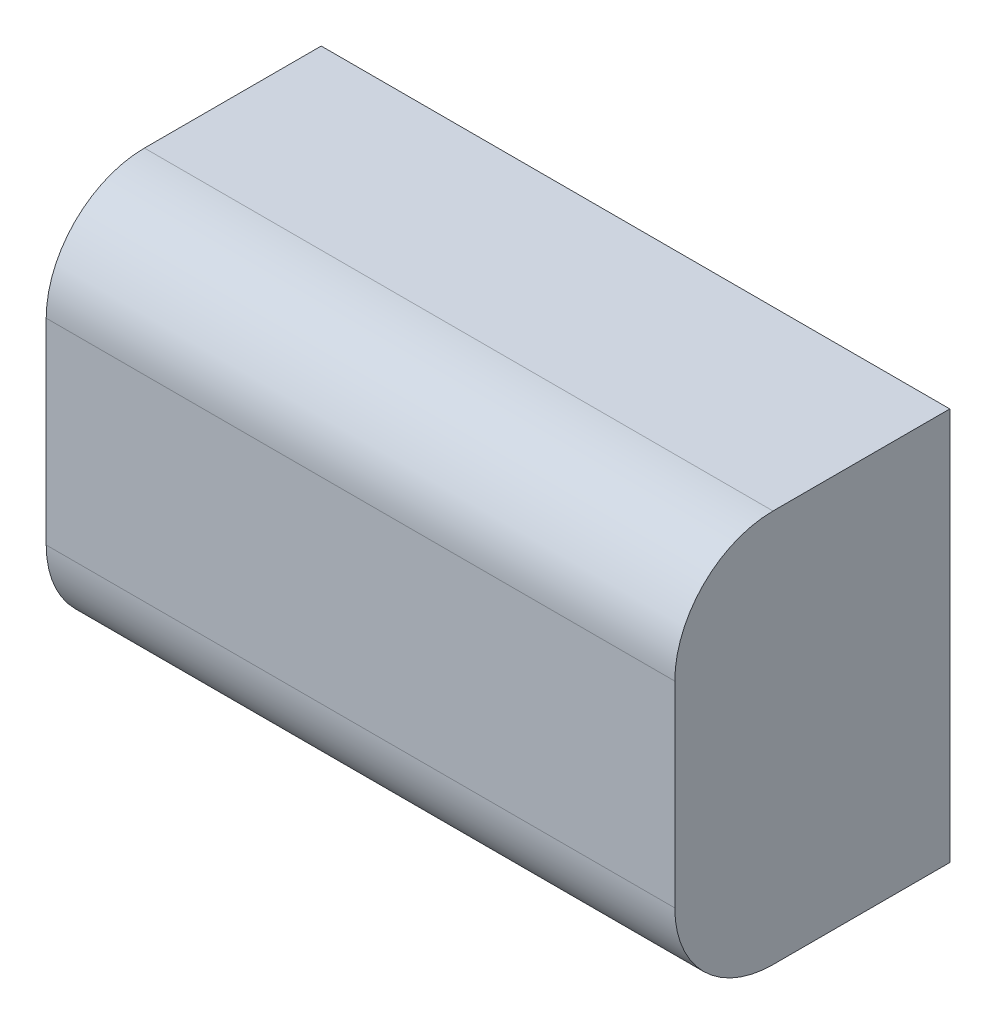
ISO-10303-21;
HEADER;
FILE_DESCRIPTION(('STEP AP214'),'2;1');
FILE_NAME('part.step','',(''),(''),'','','');
FILE_SCHEMA(('AUTOMOTIVE_DESIGN { 1 0 10303 214 1 1 1 1 }'));
ENDSEC;
DATA;
#1=APPLICATION_CONTEXT('core data for automotive mechanical design processes');
#2=APPLICATION_PROTOCOL_DEFINITION('international standard','automotive_design',2000,#1);
#3=PRODUCT_CONTEXT('',#1,'mechanical');
#4=PRODUCT('Part','Part','',(#3));
#5=PRODUCT_RELATED_PRODUCT_CATEGORY('part','',(#4));
#6=PRODUCT_DEFINITION_FORMATION('','',#4);
#7=PRODUCT_DEFINITION_CONTEXT('part definition',#1,'design');
#8=PRODUCT_DEFINITION('design','',#6,#7);
#9=PRODUCT_DEFINITION_SHAPE('','',#8);
#10=(LENGTH_UNIT() NAMED_UNIT(*) SI_UNIT(.MILLI.,.METRE.));
#11=(NAMED_UNIT(*) PLANE_ANGLE_UNIT() SI_UNIT($,.RADIAN.));
#12=(NAMED_UNIT(*) SI_UNIT($,.STERADIAN.) SOLID_ANGLE_UNIT());
#13=UNCERTAINTY_MEASURE_WITH_UNIT(LENGTH_MEASURE(1.E-05),#10,'distance_accuracy_value','');
#14=(GEOMETRIC_REPRESENTATION_CONTEXT(3) GLOBAL_UNCERTAINTY_ASSIGNED_CONTEXT((#13)) GLOBAL_UNIT_ASSIGNED_CONTEXT((#10,
#11,#12)) REPRESENTATION_CONTEXT('',''));
#15=CARTESIAN_POINT('',(0.,0.,0.));
#16=DIRECTION('',(0.,0.,1.));
#17=DIRECTION('',(1.,0.,0.));
#18=AXIS2_PLACEMENT_3D('',#15,#16,#17);
#19=CARTESIAN_POINT('',(101.6,63.5,44.45));
#20=DIRECTION('',(-1.,0.,0.));
#21=DIRECTION('',(0.,0.,1.));
#22=AXIS2_PLACEMENT_3D('',#19,#20,#21);
#23=PLANE('',#22);
#24=DIRECTION('',(0.,1.,0.));
#25=VECTOR('',#24,1.);
#26=CARTESIAN_POINT('',(101.6,63.5,44.45));
#27=LINE('',#26,#25);
#28=CARTESIAN_POINT('',(101.6,-31.75,44.45));
#29=VERTEX_POINT('',#28);
#30=CARTESIAN_POINT('',(101.6,31.75,44.45));
#31=VERTEX_POINT('',#30);
#32=EDGE_CURVE('E121',#29,#31,#27,.T.);
#33=ORIENTED_EDGE('',*,*,#32,.F.);
#34=CARTESIAN_POINT('',(101.6,-31.75,12.7));
#35=DIRECTION('',(-1.,0.,0.));
#36=DIRECTION('',(0.,0.,1.));
#37=AXIS2_PLACEMENT_3D('',#34,#35,#36);
#38=CIRCLE('',#37,31.75);
#39=CARTESIAN_POINT('',(101.6,-63.5,12.7));
#40=VERTEX_POINT('',#39);
#41=EDGE_CURVE('E133',#29,#40,#38,.F.);
#42=ORIENTED_EDGE('',*,*,#41,.T.);
#43=DIRECTION('',(0.,0.,-1.));
#44=VECTOR('',#43,1.);
#45=CARTESIAN_POINT('',(101.6,-63.5,44.45));
#46=LINE('',#45,#44);
#47=CARTESIAN_POINT('',(101.6,-63.5,-44.45));
#48=VERTEX_POINT('',#47);
#49=EDGE_CURVE('E107',#40,#48,#46,.T.);
#50=ORIENTED_EDGE('',*,*,#49,.T.);
#51=DIRECTION('',(0.,1.,0.));
#52=VECTOR('',#51,1.);
#53=CARTESIAN_POINT('',(101.6,63.5,-44.45));
#54=LINE('',#53,#52);
#55=CARTESIAN_POINT('',(101.6,63.5,-44.45));
#56=VERTEX_POINT('',#55);
#57=EDGE_CURVE('E102',#48,#56,#54,.T.);
#58=ORIENTED_EDGE('',*,*,#57,.T.);
#59=DIRECTION('',(0.,0.,-1.));
#60=VECTOR('',#59,1.);
#61=CARTESIAN_POINT('',(101.6,63.5,44.45));
#62=LINE('',#61,#60);
#63=CARTESIAN_POINT('',(101.6,63.5,12.7));
#64=VERTEX_POINT('',#63);
#65=EDGE_CURVE('E86',#64,#56,#62,.T.);
#66=ORIENTED_EDGE('',*,*,#65,.F.);
#67=CARTESIAN_POINT('',(101.6,31.75,12.7));
#68=DIRECTION('',(-1.,0.,0.));
#69=DIRECTION('',(0.,0.,1.));
#70=AXIS2_PLACEMENT_3D('',#67,#68,#69);
#71=CIRCLE('',#70,31.75);
#72=EDGE_CURVE('E131',#64,#31,#71,.F.);
#73=ORIENTED_EDGE('',*,*,#72,.T.);
#74=EDGE_LOOP('',(#33,#42,#50,#58,#66,#73));
#75=FACE_BOUND('',#74,.T.);
#76=ADVANCED_FACE('F33',(#75),#23,.F.);
#77=CARTESIAN_POINT('',(-101.6,63.5,44.45));
#78=DIRECTION('',(0.,-1.,0.));
#79=DIRECTION('',(0.,0.,-1.));
#80=AXIS2_PLACEMENT_3D('',#77,#78,#79);
#81=PLANE('',#80);
#82=DIRECTION('',(0.,0.,-1.));
#83=VECTOR('',#82,1.);
#84=CARTESIAN_POINT('',(-101.6,63.5,44.45));
#85=LINE('',#84,#83);
#86=CARTESIAN_POINT('',(-101.6,63.5,12.7));
#87=VERTEX_POINT('',#86);
#88=CARTESIAN_POINT('',(-101.6,63.5,-44.45));
#89=VERTEX_POINT('',#88);
#90=EDGE_CURVE('E96',#87,#89,#85,.T.);
#91=ORIENTED_EDGE('',*,*,#90,.F.);
#92=DIRECTION('',(-1.,0.,0.));
#93=VECTOR('',#92,1.);
#94=CARTESIAN_POINT('',(101.6,63.5,12.7));
#95=LINE('',#94,#93);
#96=EDGE_CURVE('E11',#87,#64,#95,.F.);
#97=ORIENTED_EDGE('',*,*,#96,.T.);
#98=ORIENTED_EDGE('',*,*,#65,.T.);
#99=DIRECTION('',(-1.,0.,0.));
#100=VECTOR('',#99,1.);
#101=CARTESIAN_POINT('',(-101.6,63.5,-44.45));
#102=LINE('',#101,#100);
#103=EDGE_CURVE('E89',#56,#89,#102,.T.);
#104=ORIENTED_EDGE('',*,*,#103,.T.);
#105=EDGE_LOOP('',(#91,#97,#98,#104));
#106=FACE_BOUND('',#105,.T.);
#107=ADVANCED_FACE('F88',(#106),#81,.F.);
#108=CARTESIAN_POINT('',(-101.6,63.5,44.45));
#109=DIRECTION('',(1.,0.,0.));
#110=DIRECTION('',(0.,1.,0.));
#111=AXIS2_PLACEMENT_3D('',#108,#109,#110);
#112=PLANE('',#111);
#113=DIRECTION('',(0.,0.,-1.));
#114=VECTOR('',#113,1.);
#115=CARTESIAN_POINT('',(-101.6,-63.5,44.45));
#116=LINE('',#115,#114);
#117=CARTESIAN_POINT('',(-101.6,-63.5,12.7));
#118=VERTEX_POINT('',#117);
#119=CARTESIAN_POINT('',(-101.6,-63.5,-44.45));
#120=VERTEX_POINT('',#119);
#121=EDGE_CURVE('E123',#118,#120,#116,.T.);
#122=ORIENTED_EDGE('',*,*,#121,.F.);
#123=CARTESIAN_POINT('',(-101.6,-31.75,12.7));
#124=DIRECTION('',(1.,0.,0.));
#125=DIRECTION('',(0.,1.,0.));
#126=AXIS2_PLACEMENT_3D('',#123,#124,#125);
#127=CIRCLE('',#126,31.75);
#128=CARTESIAN_POINT('',(-101.6,-31.75,44.45));
#129=VERTEX_POINT('',#128);
#130=EDGE_CURVE('E41',#118,#129,#127,.F.);
#131=ORIENTED_EDGE('',*,*,#130,.T.);
#132=DIRECTION('',(0.,-1.,0.));
#133=VECTOR('',#132,1.);
#134=CARTESIAN_POINT('',(-101.6,63.5,44.45));
#135=LINE('',#134,#133);
#136=CARTESIAN_POINT('',(-101.6,31.75,44.45));
#137=VERTEX_POINT('',#136);
#138=EDGE_CURVE('E115',#137,#129,#135,.T.);
#139=ORIENTED_EDGE('',*,*,#138,.F.);
#140=CARTESIAN_POINT('',(-101.6,31.75,12.7));
#141=DIRECTION('',(1.,0.,0.));
#142=DIRECTION('',(0.,1.,0.));
#143=AXIS2_PLACEMENT_3D('',#140,#141,#142);
#144=CIRCLE('',#143,31.75);
#145=EDGE_CURVE('E48',#137,#87,#144,.F.);
#146=ORIENTED_EDGE('',*,*,#145,.T.);
#147=ORIENTED_EDGE('',*,*,#90,.T.);
#148=DIRECTION('',(0.,-1.,0.));
#149=VECTOR('',#148,1.);
#150=CARTESIAN_POINT('',(-101.6,63.5,-44.45));
#151=LINE('',#150,#149);
#152=EDGE_CURVE('E104',#89,#120,#151,.T.);
#153=ORIENTED_EDGE('',*,*,#152,.T.);
#154=EDGE_LOOP('',(#122,#131,#139,#146,#147,#153));
#155=FACE_BOUND('',#154,.T.);
#156=ADVANCED_FACE('F138',(#155),#112,.F.);
#157=CARTESIAN_POINT('',(-101.6,-63.5,44.45));
#158=DIRECTION('',(0.,1.,0.));
#159=DIRECTION('',(0.,0.,1.));
#160=AXIS2_PLACEMENT_3D('',#157,#158,#159);
#161=PLANE('',#160);
#162=ORIENTED_EDGE('',*,*,#49,.F.);
#163=DIRECTION('',(1.,0.,0.));
#164=VECTOR('',#163,1.);
#165=CARTESIAN_POINT('',(-101.6,-63.5,12.7));
#166=LINE('',#165,#164);
#167=EDGE_CURVE('E56',#40,#118,#166,.F.);
#168=ORIENTED_EDGE('',*,*,#167,.T.);
#169=ORIENTED_EDGE('',*,*,#121,.T.);
#170=DIRECTION('',(1.,0.,0.));
#171=VECTOR('',#170,1.);
#172=CARTESIAN_POINT('',(-101.6,-63.5,-44.45));
#173=LINE('',#172,#171);
#174=EDGE_CURVE('E119',#120,#48,#173,.T.);
#175=ORIENTED_EDGE('',*,*,#174,.T.);
#176=EDGE_LOOP('',(#162,#168,#169,#175));
#177=FACE_BOUND('',#176,.T.);
#178=ADVANCED_FACE('F146',(#177),#161,.F.);
#179=CARTESIAN_POINT('',(0.,0.,44.45));
#180=DIRECTION('',(0.,0.,1.));
#181=DIRECTION('',(1.,0.,0.));
#182=AXIS2_PLACEMENT_3D('',#179,#180,#181);
#183=PLANE('',#182);
#184=ORIENTED_EDGE('',*,*,#138,.T.);
#185=DIRECTION('',(1.,0.,0.));
#186=VECTOR('',#185,1.);
#187=CARTESIAN_POINT('',(101.6,-31.75,44.45));
#188=LINE('',#187,#186);
#189=EDGE_CURVE('E128',#129,#29,#188,.T.);
#190=ORIENTED_EDGE('',*,*,#189,.T.);
#191=ORIENTED_EDGE('',*,*,#32,.T.);
#192=DIRECTION('',(-1.,0.,0.));
#193=VECTOR('',#192,1.);
#194=CARTESIAN_POINT('',(-101.6,31.75,44.45));
#195=LINE('',#194,#193);
#196=EDGE_CURVE('E95',#31,#137,#195,.T.);
#197=ORIENTED_EDGE('',*,*,#196,.T.);
#198=EDGE_LOOP('',(#184,#190,#191,#197));
#199=FACE_BOUND('',#198,.T.);
#200=ADVANCED_FACE('F142',(#199),#183,.T.);
#201=CARTESIAN_POINT('',(0.,0.,-44.45));
#202=DIRECTION('',(0.,0.,1.));
#203=DIRECTION('',(1.,0.,0.));
#204=AXIS2_PLACEMENT_3D('',#201,#202,#203);
#205=PLANE('',#204);
#206=CARTESIAN_POINT('',(-12.7,0.,-44.45));
#207=DIRECTION('',(0.,0.,-1.));
#208=DIRECTION('',(-1.,0.,0.));
#209=AXIS2_PLACEMENT_3D('',#206,#207,#208);
#210=CIRCLE('',#209,4.7625);
#211=CARTESIAN_POINT('',(-17.4625,0.,-44.45));
#212=VERTEX_POINT('',#211);
#213=EDGE_CURVE('E152',#212,#212,#210,.T.);
#214=ORIENTED_EDGE('',*,*,#213,.F.);
#215=EDGE_LOOP('',(#214));
#216=FACE_BOUND('',#215,.T.);
#217=CARTESIAN_POINT('',(12.7,0.,-44.45));
#218=DIRECTION('',(0.,0.,-1.));
#219=DIRECTION('',(-1.,0.,0.));
#220=AXIS2_PLACEMENT_3D('',#217,#218,#219);
#221=CIRCLE('',#220,4.7625);
#222=CARTESIAN_POINT('',(7.9375,0.,-44.45));
#223=VERTEX_POINT('',#222);
#224=EDGE_CURVE('E112',#223,#223,#221,.T.);
#225=ORIENTED_EDGE('',*,*,#224,.F.);
#226=EDGE_LOOP('',(#225));
#227=FACE_BOUND('',#226,.T.);
#228=ORIENTED_EDGE('',*,*,#57,.F.);
#229=ORIENTED_EDGE('',*,*,#174,.F.);
#230=ORIENTED_EDGE('',*,*,#152,.F.);
#231=ORIENTED_EDGE('',*,*,#103,.F.);
#232=EDGE_LOOP('',(#228,#229,#230,#231));
#233=FACE_BOUND('',#232,.T.);
#234=ADVANCED_FACE('F100',(#216,#227,#233),#205,.F.);
#235=CARTESIAN_POINT('',(0.,-31.75,12.7));
#236=DIRECTION('',(-1.,0.,0.));
#237=DIRECTION('',(0.,0.,1.));
#238=AXIS2_PLACEMENT_3D('',#235,#236,#237);
#239=CYLINDRICAL_SURFACE('',#238,31.75);
#240=ORIENTED_EDGE('',*,*,#130,.F.);
#241=ORIENTED_EDGE('',*,*,#167,.F.);
#242=ORIENTED_EDGE('',*,*,#41,.F.);
#243=ORIENTED_EDGE('',*,*,#189,.F.);
#244=EDGE_LOOP('',(#240,#241,#242,#243));
#245=FACE_BOUND('',#244,.T.);
#246=ADVANCED_FACE('F145',(#245),#239,.T.);
#247=CARTESIAN_POINT('',(0.,31.75,12.7));
#248=DIRECTION('',(1.,0.,0.));
#249=DIRECTION('',(0.,0.,-1.));
#250=AXIS2_PLACEMENT_3D('',#247,#248,#249);
#251=CYLINDRICAL_SURFACE('',#250,31.75);
#252=ORIENTED_EDGE('',*,*,#72,.F.);
#253=ORIENTED_EDGE('',*,*,#96,.F.);
#254=ORIENTED_EDGE('',*,*,#145,.F.);
#255=ORIENTED_EDGE('',*,*,#196,.F.);
#256=EDGE_LOOP('',(#252,#253,#254,#255));
#257=FACE_BOUND('',#256,.T.);
#258=ADVANCED_FACE('F35',(#257),#251,.T.);
#259=CARTESIAN_POINT('',(12.7,0.,-19.05));
#260=DIRECTION('',(0.,0.,-1.));
#261=DIRECTION('',(-1.,0.,0.));
#262=AXIS2_PLACEMENT_3D('',#259,#260,#261);
#263=CYLINDRICAL_SURFACE('',#262,4.7625);
#264=CARTESIAN_POINT('',(12.7,0.,-19.05));
#265=DIRECTION('',(0.,0.,-1.));
#266=DIRECTION('',(-1.,0.,0.));
#267=AXIS2_PLACEMENT_3D('',#264,#265,#266);
#268=CIRCLE('',#267,4.7625);
#269=CARTESIAN_POINT('',(7.9375,0.,-19.05));
#270=VERTEX_POINT('',#269);
#271=EDGE_CURVE('E109',#270,#270,#268,.T.);
#272=ORIENTED_EDGE('',*,*,#271,.F.);
#273=EDGE_LOOP('',(#272));
#274=FACE_BOUND('',#273,.T.);
#275=ORIENTED_EDGE('',*,*,#224,.T.);
#276=EDGE_LOOP('',(#275));
#277=FACE_BOUND('',#276,.T.);
#278=ADVANCED_FACE('F172',(#274,#277),#263,.F.);
#279=CARTESIAN_POINT('',(12.7,0.,-19.05));
#280=DIRECTION('',(0.,0.,-1.));
#281=DIRECTION('',(-1.,0.,0.));
#282=AXIS2_PLACEMENT_3D('',#279,#280,#281);
#283=PLANE('',#282);
#284=ORIENTED_EDGE('',*,*,#271,.T.);
#285=EDGE_LOOP('',(#284));
#286=FACE_BOUND('',#285,.T.);
#287=ADVANCED_FACE('F163',(#286),#283,.T.);
#288=CARTESIAN_POINT('',(-12.7,0.,-19.05));
#289=DIRECTION('',(0.,0.,-1.));
#290=DIRECTION('',(-1.,0.,0.));
#291=AXIS2_PLACEMENT_3D('',#288,#289,#290);
#292=CYLINDRICAL_SURFACE('',#291,4.7625);
#293=CARTESIAN_POINT('',(-12.7,0.,-19.05));
#294=DIRECTION('',(0.,0.,-1.));
#295=DIRECTION('',(-1.,0.,0.));
#296=AXIS2_PLACEMENT_3D('',#293,#294,#295);
#297=CIRCLE('',#296,4.7625);
#298=CARTESIAN_POINT('',(-17.4625,0.,-19.05));
#299=VERTEX_POINT('',#298);
#300=EDGE_CURVE('E150',#299,#299,#297,.T.);
#301=ORIENTED_EDGE('',*,*,#300,.F.);
#302=EDGE_LOOP('',(#301));
#303=FACE_BOUND('',#302,.T.);
#304=ORIENTED_EDGE('',*,*,#213,.T.);
#305=EDGE_LOOP('',(#304));
#306=FACE_BOUND('',#305,.T.);
#307=ADVANCED_FACE('F160',(#303,#306),#292,.F.);
#308=CARTESIAN_POINT('',(-12.7,0.,-19.05));
#309=DIRECTION('',(0.,0.,-1.));
#310=DIRECTION('',(-1.,0.,0.));
#311=AXIS2_PLACEMENT_3D('',#308,#309,#310);
#312=PLANE('',#311);
#313=ORIENTED_EDGE('',*,*,#300,.T.);
#314=EDGE_LOOP('',(#313));
#315=FACE_BOUND('',#314,.T.);
#316=ADVANCED_FACE('F158',(#315),#312,.T.);
#317=CLOSED_SHELL('',(#76,#107,#156,#178,#200,#234,#246,#258,#278,#287,#307,#316));
#318=MANIFOLD_SOLID_BREP('B2',#317);
#319=ADVANCED_BREP_SHAPE_REPRESENTATION('',(#18,#318),#14);
#320=SHAPE_DEFINITION_REPRESENTATION(#9,#319);
ENDSEC;
END-ISO-10303-21;
